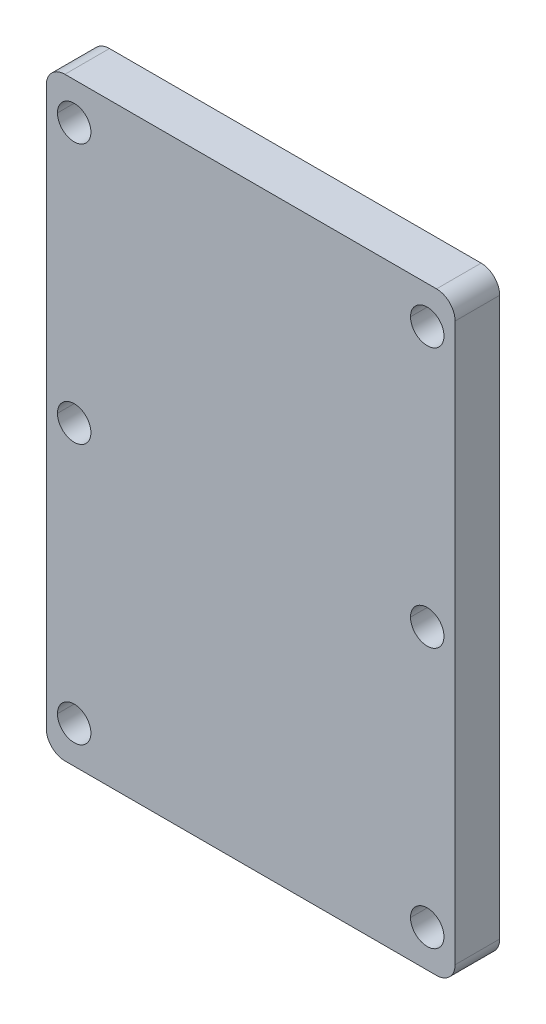
ISO-10303-21;
HEADER;
FILE_DESCRIPTION(('STEP AP214'),'2;1');
FILE_NAME('part.step','',(''),(''),'','','');
FILE_SCHEMA(('AUTOMOTIVE_DESIGN { 1 0 10303 214 1 1 1 1 }'));
ENDSEC;
DATA;
#1=APPLICATION_CONTEXT('core data for automotive mechanical design processes');
#2=APPLICATION_PROTOCOL_DEFINITION('international standard','automotive_design',2000,#1);
#3=PRODUCT_CONTEXT('',#1,'mechanical');
#4=PRODUCT('Part','Part','',(#3));
#5=PRODUCT_RELATED_PRODUCT_CATEGORY('part','',(#4));
#6=PRODUCT_DEFINITION_FORMATION('','',#4);
#7=PRODUCT_DEFINITION_CONTEXT('part definition',#1,'design');
#8=PRODUCT_DEFINITION('design','',#6,#7);
#9=PRODUCT_DEFINITION_SHAPE('','',#8);
#10=(LENGTH_UNIT() NAMED_UNIT(*) SI_UNIT(.MILLI.,.METRE.));
#11=(NAMED_UNIT(*) PLANE_ANGLE_UNIT() SI_UNIT($,.RADIAN.));
#12=(NAMED_UNIT(*) SI_UNIT($,.STERADIAN.) SOLID_ANGLE_UNIT());
#13=UNCERTAINTY_MEASURE_WITH_UNIT(LENGTH_MEASURE(1.E-05),#10,'distance_accuracy_value','');
#14=(GEOMETRIC_REPRESENTATION_CONTEXT(3) GLOBAL_UNCERTAINTY_ASSIGNED_CONTEXT((#13)) GLOBAL_UNIT_ASSIGNED_CONTEXT((#10,
#11,#12)) REPRESENTATION_CONTEXT('',''));
#15=CARTESIAN_POINT('',(0.,0.,0.));
#16=DIRECTION('',(0.,0.,1.));
#17=DIRECTION('',(1.,0.,0.));
#18=AXIS2_PLACEMENT_3D('',#15,#16,#17);
#19=CARTESIAN_POINT('',(-47.5,70.,55.));
#20=DIRECTION('',(0.,0.,-1.));
#21=DIRECTION('',(-1.,0.,0.));
#22=AXIS2_PLACEMENT_3D('',#19,#20,#21);
#23=CYLINDRICAL_SURFACE('',#22,4.5);
#24=DIRECTION('',(0.,0.,-1.));
#25=VECTOR('',#24,1.);
#26=CARTESIAN_POINT('',(-43.,70.,55.));
#27=LINE('',#26,#25);
#28=CARTESIAN_POINT('',(-43.,70.,12.));
#29=VERTEX_POINT('',#28);
#30=CARTESIAN_POINT('',(-43.,70.,0.));
#31=VERTEX_POINT('',#30);
#32=EDGE_CURVE('E385',#29,#31,#27,.T.);
#33=ORIENTED_EDGE('',*,*,#32,.F.);
#34=CARTESIAN_POINT('',(-47.5,70.,12.));
#35=DIRECTION('',(0.,0.,-1.));
#36=DIRECTION('',(1.,0.,0.));
#37=AXIS2_PLACEMENT_3D('',#34,#35,#36);
#38=CIRCLE('',#37,4.5);
#39=CARTESIAN_POINT('',(-52.,70.,12.));
#40=VERTEX_POINT('',#39);
#41=EDGE_CURVE('E204',#40,#29,#38,.T.);
#42=ORIENTED_EDGE('',*,*,#41,.F.);
#43=DIRECTION('',(0.,0.,-1.));
#44=VECTOR('',#43,1.);
#45=CARTESIAN_POINT('',(-52.,70.,55.));
#46=LINE('',#45,#44);
#47=CARTESIAN_POINT('',(-52.,70.,0.));
#48=VERTEX_POINT('',#47);
#49=EDGE_CURVE('E384',#40,#48,#46,.T.);
#50=ORIENTED_EDGE('',*,*,#49,.T.);
#51=CARTESIAN_POINT('',(-47.5,70.,0.));
#52=DIRECTION('',(0.,0.,1.));
#53=DIRECTION('',(1.,0.,0.));
#54=AXIS2_PLACEMENT_3D('',#51,#52,#53);
#55=CIRCLE('',#54,4.5);
#56=EDGE_CURVE('E310',#31,#48,#55,.T.);
#57=ORIENTED_EDGE('',*,*,#56,.F.);
#58=EDGE_LOOP('',(#33,#42,#50,#57));
#59=FACE_BOUND('',#58,.T.);
#60=ADVANCED_FACE('F17',(#59),#23,.F.);
#61=CARTESIAN_POINT('',(-47.5,0.,55.));
#62=DIRECTION('',(0.,0.,-1.));
#63=DIRECTION('',(-1.,0.,0.));
#64=AXIS2_PLACEMENT_3D('',#61,#62,#63);
#65=CYLINDRICAL_SURFACE('',#64,4.5);
#66=DIRECTION('',(0.,0.,-1.));
#67=VECTOR('',#66,1.);
#68=CARTESIAN_POINT('',(-43.,0.,55.));
#69=LINE('',#68,#67);
#70=CARTESIAN_POINT('',(-43.,0.,12.));
#71=VERTEX_POINT('',#70);
#72=CARTESIAN_POINT('',(-43.,0.,0.));
#73=VERTEX_POINT('',#72);
#74=EDGE_CURVE('E337',#71,#73,#69,.T.);
#75=ORIENTED_EDGE('',*,*,#74,.F.);
#76=CARTESIAN_POINT('',(-47.5,0.,12.));
#77=DIRECTION('',(0.,0.,-1.));
#78=DIRECTION('',(1.,0.,0.));
#79=AXIS2_PLACEMENT_3D('',#76,#77,#78);
#80=CIRCLE('',#79,4.5);
#81=CARTESIAN_POINT('',(-52.,0.,12.));
#82=VERTEX_POINT('',#81);
#83=EDGE_CURVE('E277',#82,#71,#80,.T.);
#84=ORIENTED_EDGE('',*,*,#83,.F.);
#85=DIRECTION('',(0.,0.,-1.));
#86=VECTOR('',#85,1.);
#87=CARTESIAN_POINT('',(-52.,0.,55.));
#88=LINE('',#87,#86);
#89=CARTESIAN_POINT('',(-52.,0.,0.));
#90=VERTEX_POINT('',#89);
#91=EDGE_CURVE('E336',#82,#90,#88,.T.);
#92=ORIENTED_EDGE('',*,*,#91,.T.);
#93=CARTESIAN_POINT('',(-47.5,0.,0.));
#94=DIRECTION('',(0.,0.,1.));
#95=DIRECTION('',(1.,0.,0.));
#96=AXIS2_PLACEMENT_3D('',#93,#94,#95);
#97=CIRCLE('',#96,4.5);
#98=EDGE_CURVE('E229',#73,#90,#97,.T.);
#99=ORIENTED_EDGE('',*,*,#98,.F.);
#100=EDGE_LOOP('',(#75,#84,#92,#99));
#101=FACE_BOUND('',#100,.T.);
#102=ADVANCED_FACE('F422',(#101),#65,.F.);
#103=CARTESIAN_POINT('',(-47.5,-70.,55.));
#104=DIRECTION('',(0.,0.,-1.));
#105=DIRECTION('',(-1.,0.,0.));
#106=AXIS2_PLACEMENT_3D('',#103,#104,#105);
#107=CYLINDRICAL_SURFACE('',#106,4.5);
#108=DIRECTION('',(0.,0.,-1.));
#109=VECTOR('',#108,1.);
#110=CARTESIAN_POINT('',(-43.,-70.,55.));
#111=LINE('',#110,#109);
#112=CARTESIAN_POINT('',(-43.,-70.,12.));
#113=VERTEX_POINT('',#112);
#114=CARTESIAN_POINT('',(-43.,-70.,0.));
#115=VERTEX_POINT('',#114);
#116=EDGE_CURVE('E327',#113,#115,#111,.T.);
#117=ORIENTED_EDGE('',*,*,#116,.F.);
#118=CARTESIAN_POINT('',(-47.5,-70.,12.));
#119=DIRECTION('',(0.,0.,-1.));
#120=DIRECTION('',(1.,0.,0.));
#121=AXIS2_PLACEMENT_3D('',#118,#119,#120);
#122=CIRCLE('',#121,4.5);
#123=CARTESIAN_POINT('',(-52.,-70.,12.));
#124=VERTEX_POINT('',#123);
#125=EDGE_CURVE('E274',#124,#113,#122,.T.);
#126=ORIENTED_EDGE('',*,*,#125,.F.);
#127=DIRECTION('',(0.,0.,-1.));
#128=VECTOR('',#127,1.);
#129=CARTESIAN_POINT('',(-52.,-70.,55.));
#130=LINE('',#129,#128);
#131=CARTESIAN_POINT('',(-52.,-70.,0.));
#132=VERTEX_POINT('',#131);
#133=EDGE_CURVE('E374',#124,#132,#130,.T.);
#134=ORIENTED_EDGE('',*,*,#133,.T.);
#135=CARTESIAN_POINT('',(-47.5,-70.,0.));
#136=DIRECTION('',(0.,0.,1.));
#137=DIRECTION('',(1.,0.,0.));
#138=AXIS2_PLACEMENT_3D('',#135,#136,#137);
#139=CIRCLE('',#138,4.5);
#140=EDGE_CURVE('E364',#115,#132,#139,.T.);
#141=ORIENTED_EDGE('',*,*,#140,.F.);
#142=EDGE_LOOP('',(#117,#126,#134,#141));
#143=FACE_BOUND('',#142,.T.);
#144=ADVANCED_FACE('F620',(#143),#107,.F.);
#145=CARTESIAN_POINT('',(47.5,70.,55.));
#146=DIRECTION('',(0.,0.,-1.));
#147=DIRECTION('',(-1.,0.,0.));
#148=AXIS2_PLACEMENT_3D('',#145,#146,#147);
#149=CYLINDRICAL_SURFACE('',#148,4.5);
#150=DIRECTION('',(0.,0.,-1.));
#151=VECTOR('',#150,1.);
#152=CARTESIAN_POINT('',(52.,70.,55.));
#153=LINE('',#152,#151);
#154=CARTESIAN_POINT('',(52.,70.,12.));
#155=VERTEX_POINT('',#154);
#156=CARTESIAN_POINT('',(52.,70.,0.));
#157=VERTEX_POINT('',#156);
#158=EDGE_CURVE('E242',#155,#157,#153,.T.);
#159=ORIENTED_EDGE('',*,*,#158,.F.);
#160=CARTESIAN_POINT('',(47.5,70.,12.));
#161=DIRECTION('',(0.,0.,1.));
#162=DIRECTION('',(1.,0.,0.));
#163=AXIS2_PLACEMENT_3D('',#160,#161,#162);
#164=CIRCLE('',#163,4.5);
#165=CARTESIAN_POINT('',(43.,70.,12.));
#166=VERTEX_POINT('',#165);
#167=EDGE_CURVE('E276',#155,#166,#164,.T.);
#168=ORIENTED_EDGE('',*,*,#167,.T.);
#169=DIRECTION('',(0.,0.,-1.));
#170=VECTOR('',#169,1.);
#171=CARTESIAN_POINT('',(43.,70.,55.));
#172=LINE('',#171,#170);
#173=CARTESIAN_POINT('',(43.,70.,0.));
#174=VERTEX_POINT('',#173);
#175=EDGE_CURVE('E273',#166,#174,#172,.T.);
#176=ORIENTED_EDGE('',*,*,#175,.T.);
#177=CARTESIAN_POINT('',(47.5,70.,0.));
#178=DIRECTION('',(0.,0.,-1.));
#179=DIRECTION('',(-1.,0.,0.));
#180=AXIS2_PLACEMENT_3D('',#177,#178,#179);
#181=CIRCLE('',#180,4.5);
#182=EDGE_CURVE('E322',#174,#157,#181,.T.);
#183=ORIENTED_EDGE('',*,*,#182,.T.);
#184=EDGE_LOOP('',(#159,#168,#176,#183));
#185=FACE_BOUND('',#184,.T.);
#186=ADVANCED_FACE('F624',(#185),#149,.F.);
#187=CARTESIAN_POINT('',(47.5,0.,55.));
#188=DIRECTION('',(0.,0.,-1.));
#189=DIRECTION('',(-1.,0.,0.));
#190=AXIS2_PLACEMENT_3D('',#187,#188,#189);
#191=CYLINDRICAL_SURFACE('',#190,4.5);
#192=DIRECTION('',(0.,0.,-1.));
#193=VECTOR('',#192,1.);
#194=CARTESIAN_POINT('',(52.,0.,55.));
#195=LINE('',#194,#193);
#196=CARTESIAN_POINT('',(52.,0.,12.));
#197=VERTEX_POINT('',#196);
#198=CARTESIAN_POINT('',(52.,0.,0.));
#199=VERTEX_POINT('',#198);
#200=EDGE_CURVE('E241',#197,#199,#195,.T.);
#201=ORIENTED_EDGE('',*,*,#200,.F.);
#202=CARTESIAN_POINT('',(47.5,0.,12.));
#203=DIRECTION('',(0.,0.,1.));
#204=DIRECTION('',(1.,0.,0.));
#205=AXIS2_PLACEMENT_3D('',#202,#203,#204);
#206=CIRCLE('',#205,4.5);
#207=CARTESIAN_POINT('',(43.,0.,12.));
#208=VERTEX_POINT('',#207);
#209=EDGE_CURVE('E285',#197,#208,#206,.T.);
#210=ORIENTED_EDGE('',*,*,#209,.T.);
#211=DIRECTION('',(0.,0.,-1.));
#212=VECTOR('',#211,1.);
#213=CARTESIAN_POINT('',(43.,0.,55.));
#214=LINE('',#213,#212);
#215=CARTESIAN_POINT('',(43.,0.,0.));
#216=VERTEX_POINT('',#215);
#217=EDGE_CURVE('E240',#208,#216,#214,.T.);
#218=ORIENTED_EDGE('',*,*,#217,.T.);
#219=CARTESIAN_POINT('',(47.5,0.,0.));
#220=DIRECTION('',(0.,0.,-1.));
#221=DIRECTION('',(-1.,0.,0.));
#222=AXIS2_PLACEMENT_3D('',#219,#220,#221);
#223=CIRCLE('',#222,4.5);
#224=EDGE_CURVE('E28',#216,#199,#223,.T.);
#225=ORIENTED_EDGE('',*,*,#224,.T.);
#226=EDGE_LOOP('',(#201,#210,#218,#225));
#227=FACE_BOUND('',#226,.T.);
#228=ADVANCED_FACE('F645',(#227),#191,.F.);
#229=CARTESIAN_POINT('',(47.5,-70.,55.));
#230=DIRECTION('',(0.,0.,-1.));
#231=DIRECTION('',(-1.,0.,0.));
#232=AXIS2_PLACEMENT_3D('',#229,#230,#231);
#233=CYLINDRICAL_SURFACE('',#232,4.5);
#234=DIRECTION('',(0.,0.,-1.));
#235=VECTOR('',#234,1.);
#236=CARTESIAN_POINT('',(52.,-70.,55.));
#237=LINE('',#236,#235);
#238=CARTESIAN_POINT('',(52.,-70.,12.));
#239=VERTEX_POINT('',#238);
#240=CARTESIAN_POINT('',(52.,-70.,0.));
#241=VERTEX_POINT('',#240);
#242=EDGE_CURVE('E256',#239,#241,#237,.T.);
#243=ORIENTED_EDGE('',*,*,#242,.F.);
#244=CARTESIAN_POINT('',(47.5,-70.,12.));
#245=DIRECTION('',(0.,0.,1.));
#246=DIRECTION('',(1.,0.,0.));
#247=AXIS2_PLACEMENT_3D('',#244,#245,#246);
#248=CIRCLE('',#247,4.5);
#249=CARTESIAN_POINT('',(43.,-70.,12.));
#250=VERTEX_POINT('',#249);
#251=EDGE_CURVE('E306',#239,#250,#248,.T.);
#252=ORIENTED_EDGE('',*,*,#251,.T.);
#253=DIRECTION('',(0.,0.,-1.));
#254=VECTOR('',#253,1.);
#255=CARTESIAN_POINT('',(43.,-70.,55.));
#256=LINE('',#255,#254);
#257=CARTESIAN_POINT('',(43.,-70.,0.));
#258=VERTEX_POINT('',#257);
#259=EDGE_CURVE('E326',#250,#258,#256,.T.);
#260=ORIENTED_EDGE('',*,*,#259,.T.);
#261=CARTESIAN_POINT('',(47.5,-70.,0.));
#262=DIRECTION('',(0.,0.,-1.));
#263=DIRECTION('',(-1.,0.,0.));
#264=AXIS2_PLACEMENT_3D('',#261,#262,#263);
#265=CIRCLE('',#264,4.5);
#266=EDGE_CURVE('E11',#258,#241,#265,.T.);
#267=ORIENTED_EDGE('',*,*,#266,.T.);
#268=EDGE_LOOP('',(#243,#252,#260,#267));
#269=FACE_BOUND('',#268,.T.);
#270=ADVANCED_FACE('F649',(#269),#233,.F.);
#271=CARTESIAN_POINT('',(50.,75.,12.));
#272=DIRECTION('',(0.,0.,-1.));
#273=DIRECTION('',(-1.,0.,0.));
#274=AXIS2_PLACEMENT_3D('',#271,#272,#273);
#275=CYLINDRICAL_SURFACE('',#274,5.);
#276=CARTESIAN_POINT('',(50.,75.,12.));
#277=DIRECTION('',(0.,0.,1.));
#278=DIRECTION('',(1.,0.,0.));
#279=AXIS2_PLACEMENT_3D('',#276,#277,#278);
#280=CIRCLE('',#279,5.);
#281=CARTESIAN_POINT('',(55.,75.,12.));
#282=VERTEX_POINT('',#281);
#283=CARTESIAN_POINT('',(50.,80.,12.));
#284=VERTEX_POINT('',#283);
#285=EDGE_CURVE('E359',#282,#284,#280,.T.);
#286=ORIENTED_EDGE('',*,*,#285,.F.);
#287=DIRECTION('',(0.,0.,1.));
#288=VECTOR('',#287,1.);
#289=CARTESIAN_POINT('',(55.,75.,12.));
#290=LINE('',#289,#288);
#291=CARTESIAN_POINT('',(55.,75.,0.));
#292=VERTEX_POINT('',#291);
#293=EDGE_CURVE('E356',#292,#282,#290,.T.);
#294=ORIENTED_EDGE('',*,*,#293,.F.);
#295=CARTESIAN_POINT('',(50.,75.,0.));
#296=DIRECTION('',(0.,0.,-1.));
#297=DIRECTION('',(1.,0.,0.));
#298=AXIS2_PLACEMENT_3D('',#295,#296,#297);
#299=CIRCLE('',#298,5.);
#300=CARTESIAN_POINT('',(50.,80.,0.));
#301=VERTEX_POINT('',#300);
#302=EDGE_CURVE('E313',#301,#292,#299,.T.);
#303=ORIENTED_EDGE('',*,*,#302,.F.);
#304=DIRECTION('',(0.,0.,-1.));
#305=VECTOR('',#304,1.);
#306=CARTESIAN_POINT('',(50.,80.,12.));
#307=LINE('',#306,#305);
#308=EDGE_CURVE('E225',#284,#301,#307,.T.);
#309=ORIENTED_EDGE('',*,*,#308,.F.);
#310=EDGE_LOOP('',(#286,#294,#303,#309));
#311=FACE_BOUND('',#310,.T.);
#312=ADVANCED_FACE('F671',(#311),#275,.T.);
#313=CARTESIAN_POINT('',(-50.,75.,12.));
#314=DIRECTION('',(0.,0.,-1.));
#315=DIRECTION('',(-1.,0.,0.));
#316=AXIS2_PLACEMENT_3D('',#313,#314,#315);
#317=CYLINDRICAL_SURFACE('',#316,5.);
#318=CARTESIAN_POINT('',(-50.,75.,12.));
#319=DIRECTION('',(0.,0.,1.));
#320=DIRECTION('',(1.,0.,0.));
#321=AXIS2_PLACEMENT_3D('',#318,#319,#320);
#322=CIRCLE('',#321,5.);
#323=CARTESIAN_POINT('',(-50.,80.,12.));
#324=VERTEX_POINT('',#323);
#325=CARTESIAN_POINT('',(-55.,75.,12.));
#326=VERTEX_POINT('',#325);
#327=EDGE_CURVE('E205',#324,#326,#322,.T.);
#328=ORIENTED_EDGE('',*,*,#327,.F.);
#329=DIRECTION('',(0.,0.,1.));
#330=VECTOR('',#329,1.);
#331=CARTESIAN_POINT('',(-50.,80.,12.));
#332=LINE('',#331,#330);
#333=CARTESIAN_POINT('',(-50.,80.,0.));
#334=VERTEX_POINT('',#333);
#335=EDGE_CURVE('E355',#334,#324,#332,.T.);
#336=ORIENTED_EDGE('',*,*,#335,.F.);
#337=CARTESIAN_POINT('',(-50.,75.,0.));
#338=DIRECTION('',(0.,0.,-1.));
#339=DIRECTION('',(1.,0.,0.));
#340=AXIS2_PLACEMENT_3D('',#337,#338,#339);
#341=CIRCLE('',#340,5.);
#342=CARTESIAN_POINT('',(-55.,75.,0.));
#343=VERTEX_POINT('',#342);
#344=EDGE_CURVE('E309',#343,#334,#341,.T.);
#345=ORIENTED_EDGE('',*,*,#344,.F.);
#346=DIRECTION('',(0.,0.,-1.));
#347=VECTOR('',#346,1.);
#348=CARTESIAN_POINT('',(-55.,75.,12.));
#349=LINE('',#348,#347);
#350=EDGE_CURVE('E214',#326,#343,#349,.T.);
#351=ORIENTED_EDGE('',*,*,#350,.F.);
#352=EDGE_LOOP('',(#328,#336,#345,#351));
#353=FACE_BOUND('',#352,.T.);
#354=ADVANCED_FACE('F450',(#353),#317,.T.);
#355=CARTESIAN_POINT('',(-50.,-75.,12.));
#356=DIRECTION('',(0.,0.,-1.));
#357=DIRECTION('',(-1.,0.,0.));
#358=AXIS2_PLACEMENT_3D('',#355,#356,#357);
#359=CYLINDRICAL_SURFACE('',#358,5.);
#360=CARTESIAN_POINT('',(-50.,-75.,12.));
#361=DIRECTION('',(0.,0.,1.));
#362=DIRECTION('',(1.,0.,0.));
#363=AXIS2_PLACEMENT_3D('',#360,#361,#362);
#364=CIRCLE('',#363,5.);
#365=CARTESIAN_POINT('',(-55.,-75.,12.));
#366=VERTEX_POINT('',#365);
#367=CARTESIAN_POINT('',(-50.,-80.,12.));
#368=VERTEX_POINT('',#367);
#369=EDGE_CURVE('E21',#366,#368,#364,.T.);
#370=ORIENTED_EDGE('',*,*,#369,.F.);
#371=DIRECTION('',(0.,0.,1.));
#372=VECTOR('',#371,1.);
#373=CARTESIAN_POINT('',(-55.,-75.,12.));
#374=LINE('',#373,#372);
#375=CARTESIAN_POINT('',(-55.,-75.,0.));
#376=VERTEX_POINT('',#375);
#377=EDGE_CURVE('E198',#376,#366,#374,.T.);
#378=ORIENTED_EDGE('',*,*,#377,.F.);
#379=CARTESIAN_POINT('',(-50.,-75.,0.));
#380=DIRECTION('',(0.,0.,-1.));
#381=DIRECTION('',(1.,0.,0.));
#382=AXIS2_PLACEMENT_3D('',#379,#380,#381);
#383=CIRCLE('',#382,5.);
#384=CARTESIAN_POINT('',(-50.,-80.,0.));
#385=VERTEX_POINT('',#384);
#386=EDGE_CURVE('E305',#385,#376,#383,.T.);
#387=ORIENTED_EDGE('',*,*,#386,.F.);
#388=DIRECTION('',(0.,0.,-1.));
#389=VECTOR('',#388,1.);
#390=CARTESIAN_POINT('',(-50.,-80.,12.));
#391=LINE('',#390,#389);
#392=EDGE_CURVE('E201',#368,#385,#391,.T.);
#393=ORIENTED_EDGE('',*,*,#392,.F.);
#394=EDGE_LOOP('',(#370,#378,#387,#393));
#395=FACE_BOUND('',#394,.T.);
#396=ADVANCED_FACE('F196',(#395),#359,.T.);
#397=CARTESIAN_POINT('',(50.,-75.,12.));
#398=DIRECTION('',(0.,0.,-1.));
#399=DIRECTION('',(-1.,0.,0.));
#400=AXIS2_PLACEMENT_3D('',#397,#398,#399);
#401=CYLINDRICAL_SURFACE('',#400,5.);
#402=CARTESIAN_POINT('',(50.,-75.,12.));
#403=DIRECTION('',(0.,0.,1.));
#404=DIRECTION('',(1.,0.,0.));
#405=AXIS2_PLACEMENT_3D('',#402,#403,#404);
#406=CIRCLE('',#405,5.);
#407=CARTESIAN_POINT('',(50.,-80.,12.));
#408=VERTEX_POINT('',#407);
#409=CARTESIAN_POINT('',(55.,-75.,12.));
#410=VERTEX_POINT('',#409);
#411=EDGE_CURVE('E341',#408,#410,#406,.T.);
#412=ORIENTED_EDGE('',*,*,#411,.F.);
#413=DIRECTION('',(0.,0.,1.));
#414=VECTOR('',#413,1.);
#415=CARTESIAN_POINT('',(50.,-80.,12.));
#416=LINE('',#415,#414);
#417=CARTESIAN_POINT('',(50.,-80.,0.));
#418=VERTEX_POINT('',#417);
#419=EDGE_CURVE('E235',#418,#408,#416,.T.);
#420=ORIENTED_EDGE('',*,*,#419,.F.);
#421=CARTESIAN_POINT('',(50.,-75.,0.));
#422=DIRECTION('',(0.,0.,-1.));
#423=DIRECTION('',(1.,0.,0.));
#424=AXIS2_PLACEMENT_3D('',#421,#422,#423);
#425=CIRCLE('',#424,5.);
#426=CARTESIAN_POINT('',(55.,-75.,0.));
#427=VERTEX_POINT('',#426);
#428=EDGE_CURVE('E302',#427,#418,#425,.T.);
#429=ORIENTED_EDGE('',*,*,#428,.F.);
#430=DIRECTION('',(0.,0.,-1.));
#431=VECTOR('',#430,1.);
#432=CARTESIAN_POINT('',(55.,-75.,12.));
#433=LINE('',#432,#431);
#434=EDGE_CURVE('E314',#410,#427,#433,.T.);
#435=ORIENTED_EDGE('',*,*,#434,.F.);
#436=EDGE_LOOP('',(#412,#420,#429,#435));
#437=FACE_BOUND('',#436,.T.);
#438=ADVANCED_FACE('F428',(#437),#401,.T.);
#439=CARTESIAN_POINT('',(0.,0.,0.));
#440=DIRECTION('',(0.,0.,1.));
#441=DIRECTION('',(1.,0.,0.));
#442=AXIS2_PLACEMENT_3D('',#439,#440,#441);
#443=PLANE('',#442);
#444=ORIENTED_EDGE('',*,*,#266,.F.);
#445=CARTESIAN_POINT('',(47.5,-70.,0.));
#446=DIRECTION('',(0.,0.,-1.));
#447=DIRECTION('',(-1.,0.,0.));
#448=AXIS2_PLACEMENT_3D('',#445,#446,#447);
#449=CIRCLE('',#448,4.5);
#450=EDGE_CURVE('E265',#241,#258,#449,.T.);
#451=ORIENTED_EDGE('',*,*,#450,.F.);
#452=EDGE_LOOP('',(#444,#451));
#453=FACE_BOUND('',#452,.T.);
#454=ORIENTED_EDGE('',*,*,#224,.F.);
#455=CARTESIAN_POINT('',(47.5,0.,0.));
#456=DIRECTION('',(0.,0.,-1.));
#457=DIRECTION('',(-1.,0.,0.));
#458=AXIS2_PLACEMENT_3D('',#455,#456,#457);
#459=CIRCLE('',#458,4.5);
#460=EDGE_CURVE('E236',#199,#216,#459,.T.);
#461=ORIENTED_EDGE('',*,*,#460,.F.);
#462=EDGE_LOOP('',(#454,#461));
#463=FACE_BOUND('',#462,.T.);
#464=ORIENTED_EDGE('',*,*,#182,.F.);
#465=CARTESIAN_POINT('',(47.5,70.,0.));
#466=DIRECTION('',(0.,0.,-1.));
#467=DIRECTION('',(-1.,0.,0.));
#468=AXIS2_PLACEMENT_3D('',#465,#466,#467);
#469=CIRCLE('',#468,4.5);
#470=EDGE_CURVE('E245',#157,#174,#469,.T.);
#471=ORIENTED_EDGE('',*,*,#470,.F.);
#472=EDGE_LOOP('',(#464,#471));
#473=FACE_BOUND('',#472,.T.);
#474=CARTESIAN_POINT('',(-47.5,-70.,0.));
#475=DIRECTION('',(0.,0.,1.));
#476=DIRECTION('',(1.,0.,0.));
#477=AXIS2_PLACEMENT_3D('',#474,#475,#476);
#478=CIRCLE('',#477,4.5);
#479=EDGE_CURVE('E331',#132,#115,#478,.T.);
#480=ORIENTED_EDGE('',*,*,#479,.T.);
#481=ORIENTED_EDGE('',*,*,#140,.T.);
#482=EDGE_LOOP('',(#480,#481));
#483=FACE_BOUND('',#482,.T.);
#484=CARTESIAN_POINT('',(-47.5,0.,0.));
#485=DIRECTION('',(0.,0.,1.));
#486=DIRECTION('',(1.,0.,0.));
#487=AXIS2_PLACEMENT_3D('',#484,#485,#486);
#488=CIRCLE('',#487,4.5);
#489=EDGE_CURVE('E333',#90,#73,#488,.T.);
#490=ORIENTED_EDGE('',*,*,#489,.T.);
#491=ORIENTED_EDGE('',*,*,#98,.T.);
#492=EDGE_LOOP('',(#490,#491));
#493=FACE_BOUND('',#492,.T.);
#494=CARTESIAN_POINT('',(-47.5,70.,0.));
#495=DIRECTION('',(0.,0.,1.));
#496=DIRECTION('',(1.,0.,0.));
#497=AXIS2_PLACEMENT_3D('',#494,#495,#496);
#498=CIRCLE('',#497,4.5);
#499=EDGE_CURVE('E380',#48,#31,#498,.T.);
#500=ORIENTED_EDGE('',*,*,#499,.T.);
#501=ORIENTED_EDGE('',*,*,#56,.T.);
#502=EDGE_LOOP('',(#500,#501));
#503=FACE_BOUND('',#502,.T.);
#504=DIRECTION('',(0.,1.,0.));
#505=VECTOR('',#504,1.);
#506=CARTESIAN_POINT('',(55.,80.,0.));
#507=LINE('',#506,#505);
#508=EDGE_CURVE('E318',#427,#292,#507,.T.);
#509=ORIENTED_EDGE('',*,*,#508,.F.);
#510=ORIENTED_EDGE('',*,*,#428,.T.);
#511=DIRECTION('',(1.,0.,0.));
#512=VECTOR('',#511,1.);
#513=CARTESIAN_POINT('',(-55.,-80.,0.));
#514=LINE('',#513,#512);
#515=EDGE_CURVE('E231',#385,#418,#514,.T.);
#516=ORIENTED_EDGE('',*,*,#515,.F.);
#517=ORIENTED_EDGE('',*,*,#386,.T.);
#518=DIRECTION('',(0.,-1.,0.));
#519=VECTOR('',#518,1.);
#520=CARTESIAN_POINT('',(-55.,80.,0.));
#521=LINE('',#520,#519);
#522=EDGE_CURVE('E218',#343,#376,#521,.T.);
#523=ORIENTED_EDGE('',*,*,#522,.F.);
#524=ORIENTED_EDGE('',*,*,#344,.T.);
#525=DIRECTION('',(-1.,0.,0.));
#526=VECTOR('',#525,1.);
#527=CARTESIAN_POINT('',(-55.,80.,0.));
#528=LINE('',#527,#526);
#529=EDGE_CURVE('E351',#301,#334,#528,.T.);
#530=ORIENTED_EDGE('',*,*,#529,.F.);
#531=ORIENTED_EDGE('',*,*,#302,.T.);
#532=EDGE_LOOP('',(#509,#510,#516,#517,#523,#524,#530,#531));
#533=FACE_BOUND('',#532,.T.);
#534=ADVANCED_FACE('F425',(#453,#463,#473,#483,#493,#503,#533),#443,.F.);
#535=CARTESIAN_POINT('',(0.,0.,12.));
#536=DIRECTION('',(0.,0.,1.));
#537=DIRECTION('',(1.,0.,0.));
#538=AXIS2_PLACEMENT_3D('',#535,#536,#537);
#539=PLANE('',#538);
#540=CARTESIAN_POINT('',(47.5,-70.,12.));
#541=DIRECTION('',(0.,0.,1.));
#542=DIRECTION('',(1.,0.,0.));
#543=AXIS2_PLACEMENT_3D('',#540,#541,#542);
#544=CIRCLE('',#543,4.5);
#545=EDGE_CURVE('E249',#250,#239,#544,.T.);
#546=ORIENTED_EDGE('',*,*,#545,.F.);
#547=ORIENTED_EDGE('',*,*,#251,.F.);
#548=EDGE_LOOP('',(#546,#547));
#549=FACE_BOUND('',#548,.T.);
#550=CARTESIAN_POINT('',(47.5,0.,12.));
#551=DIRECTION('',(0.,0.,1.));
#552=DIRECTION('',(1.,0.,0.));
#553=AXIS2_PLACEMENT_3D('',#550,#551,#552);
#554=CIRCLE('',#553,4.5);
#555=EDGE_CURVE('E270',#208,#197,#554,.T.);
#556=ORIENTED_EDGE('',*,*,#555,.F.);
#557=ORIENTED_EDGE('',*,*,#209,.F.);
#558=EDGE_LOOP('',(#556,#557));
#559=FACE_BOUND('',#558,.T.);
#560=CARTESIAN_POINT('',(47.5,70.,12.));
#561=DIRECTION('',(0.,0.,1.));
#562=DIRECTION('',(1.,0.,0.));
#563=AXIS2_PLACEMENT_3D('',#560,#561,#562);
#564=CIRCLE('',#563,4.5);
#565=EDGE_CURVE('E246',#166,#155,#564,.T.);
#566=ORIENTED_EDGE('',*,*,#565,.F.);
#567=ORIENTED_EDGE('',*,*,#167,.F.);
#568=EDGE_LOOP('',(#566,#567));
#569=FACE_BOUND('',#568,.T.);
#570=ORIENTED_EDGE('',*,*,#125,.T.);
#571=CARTESIAN_POINT('',(-47.5,-70.,12.));
#572=DIRECTION('',(0.,0.,-1.));
#573=DIRECTION('',(1.,0.,0.));
#574=AXIS2_PLACEMENT_3D('',#571,#572,#573);
#575=CIRCLE('',#574,4.5);
#576=EDGE_CURVE('E332',#113,#124,#575,.T.);
#577=ORIENTED_EDGE('',*,*,#576,.T.);
#578=EDGE_LOOP('',(#570,#577));
#579=FACE_BOUND('',#578,.T.);
#580=ORIENTED_EDGE('',*,*,#83,.T.);
#581=CARTESIAN_POINT('',(-47.5,0.,12.));
#582=DIRECTION('',(0.,0.,-1.));
#583=DIRECTION('',(1.,0.,0.));
#584=AXIS2_PLACEMENT_3D('',#581,#582,#583);
#585=CIRCLE('',#584,4.5);
#586=EDGE_CURVE('E402',#71,#82,#585,.T.);
#587=ORIENTED_EDGE('',*,*,#586,.T.);
#588=EDGE_LOOP('',(#580,#587));
#589=FACE_BOUND('',#588,.T.);
#590=ORIENTED_EDGE('',*,*,#41,.T.);
#591=CARTESIAN_POINT('',(-47.5,70.,12.));
#592=DIRECTION('',(0.,0.,-1.));
#593=DIRECTION('',(1.,0.,0.));
#594=AXIS2_PLACEMENT_3D('',#591,#592,#593);
#595=CIRCLE('',#594,4.5);
#596=EDGE_CURVE('E297',#29,#40,#595,.T.);
#597=ORIENTED_EDGE('',*,*,#596,.T.);
#598=EDGE_LOOP('',(#590,#597));
#599=FACE_BOUND('',#598,.T.);
#600=DIRECTION('',(1.,0.,0.));
#601=VECTOR('',#600,1.);
#602=CARTESIAN_POINT('',(-55.,-80.,12.));
#603=LINE('',#602,#601);
#604=EDGE_CURVE('E342',#368,#408,#603,.T.);
#605=ORIENTED_EDGE('',*,*,#604,.T.);
#606=ORIENTED_EDGE('',*,*,#411,.T.);
#607=DIRECTION('',(0.,1.,0.));
#608=VECTOR('',#607,1.);
#609=CARTESIAN_POINT('',(55.,80.,12.));
#610=LINE('',#609,#608);
#611=EDGE_CURVE('E319',#410,#282,#610,.T.);
#612=ORIENTED_EDGE('',*,*,#611,.T.);
#613=ORIENTED_EDGE('',*,*,#285,.T.);
#614=DIRECTION('',(-1.,0.,0.));
#615=VECTOR('',#614,1.);
#616=CARTESIAN_POINT('',(-55.,80.,12.));
#617=LINE('',#616,#615);
#618=EDGE_CURVE('E393',#284,#324,#617,.T.);
#619=ORIENTED_EDGE('',*,*,#618,.T.);
#620=ORIENTED_EDGE('',*,*,#327,.T.);
#621=DIRECTION('',(0.,-1.,0.));
#622=VECTOR('',#621,1.);
#623=CARTESIAN_POINT('',(-55.,80.,12.));
#624=LINE('',#623,#622);
#625=EDGE_CURVE('E207',#326,#366,#624,.T.);
#626=ORIENTED_EDGE('',*,*,#625,.T.);
#627=ORIENTED_EDGE('',*,*,#369,.T.);
#628=EDGE_LOOP('',(#605,#606,#612,#613,#619,#620,#626,#627));
#629=FACE_BOUND('',#628,.T.);
#630=ADVANCED_FACE('F208',(#549,#559,#569,#579,#589,#599,#629),#539,.T.);
#631=CARTESIAN_POINT('',(-55.,-80.,12.));
#632=DIRECTION('',(0.,1.,0.));
#633=DIRECTION('',(1.,0.,0.));
#634=AXIS2_PLACEMENT_3D('',#631,#632,#633);
#635=PLANE('',#634);
#636=ORIENTED_EDGE('',*,*,#515,.T.);
#637=ORIENTED_EDGE('',*,*,#419,.T.);
#638=ORIENTED_EDGE('',*,*,#604,.F.);
#639=ORIENTED_EDGE('',*,*,#392,.T.);
#640=EDGE_LOOP('',(#636,#637,#638,#639));
#641=FACE_BOUND('',#640,.T.);
#642=ADVANCED_FACE('F447',(#641),#635,.F.);
#643=CARTESIAN_POINT('',(-55.,80.,12.));
#644=DIRECTION('',(1.,0.,0.));
#645=DIRECTION('',(0.,-1.,0.));
#646=AXIS2_PLACEMENT_3D('',#643,#644,#645);
#647=PLANE('',#646);
#648=ORIENTED_EDGE('',*,*,#522,.T.);
#649=ORIENTED_EDGE('',*,*,#377,.T.);
#650=ORIENTED_EDGE('',*,*,#625,.F.);
#651=ORIENTED_EDGE('',*,*,#350,.T.);
#652=EDGE_LOOP('',(#648,#649,#650,#651));
#653=FACE_BOUND('',#652,.T.);
#654=ADVANCED_FACE('F216',(#653),#647,.F.);
#655=CARTESIAN_POINT('',(-55.,80.,12.));
#656=DIRECTION('',(0.,-1.,0.));
#657=DIRECTION('',(0.,0.,-1.));
#658=AXIS2_PLACEMENT_3D('',#655,#656,#657);
#659=PLANE('',#658);
#660=ORIENTED_EDGE('',*,*,#529,.T.);
#661=ORIENTED_EDGE('',*,*,#335,.T.);
#662=ORIENTED_EDGE('',*,*,#618,.F.);
#663=ORIENTED_EDGE('',*,*,#308,.T.);
#664=EDGE_LOOP('',(#660,#661,#662,#663));
#665=FACE_BOUND('',#664,.T.);
#666=ADVANCED_FACE('F19',(#665),#659,.F.);
#667=CARTESIAN_POINT('',(55.,80.,12.));
#668=DIRECTION('',(-1.,0.,0.));
#669=DIRECTION('',(0.,0.,1.));
#670=AXIS2_PLACEMENT_3D('',#667,#668,#669);
#671=PLANE('',#670);
#672=ORIENTED_EDGE('',*,*,#611,.F.);
#673=ORIENTED_EDGE('',*,*,#434,.T.);
#674=ORIENTED_EDGE('',*,*,#508,.T.);
#675=ORIENTED_EDGE('',*,*,#293,.T.);
#676=EDGE_LOOP('',(#672,#673,#674,#675));
#677=FACE_BOUND('',#676,.T.);
#678=ADVANCED_FACE('F442',(#677),#671,.F.);
#679=CARTESIAN_POINT('',(47.5,-70.,55.));
#680=DIRECTION('',(0.,0.,-1.));
#681=DIRECTION('',(-1.,0.,0.));
#682=AXIS2_PLACEMENT_3D('',#679,#680,#681);
#683=CYLINDRICAL_SURFACE('',#682,4.5);
#684=ORIENTED_EDGE('',*,*,#545,.T.);
#685=ORIENTED_EDGE('',*,*,#242,.T.);
#686=ORIENTED_EDGE('',*,*,#450,.T.);
#687=ORIENTED_EDGE('',*,*,#259,.F.);
#688=EDGE_LOOP('',(#684,#685,#686,#687));
#689=FACE_BOUND('',#688,.T.);
#690=ADVANCED_FACE('F640',(#689),#683,.F.);
#691=CARTESIAN_POINT('',(47.5,0.,55.));
#692=DIRECTION('',(0.,0.,-1.));
#693=DIRECTION('',(-1.,0.,0.));
#694=AXIS2_PLACEMENT_3D('',#691,#692,#693);
#695=CYLINDRICAL_SURFACE('',#694,4.5);
#696=ORIENTED_EDGE('',*,*,#555,.T.);
#697=ORIENTED_EDGE('',*,*,#200,.T.);
#698=ORIENTED_EDGE('',*,*,#460,.T.);
#699=ORIENTED_EDGE('',*,*,#217,.F.);
#700=EDGE_LOOP('',(#696,#697,#698,#699));
#701=FACE_BOUND('',#700,.T.);
#702=ADVANCED_FACE('F687',(#701),#695,.F.);
#703=CARTESIAN_POINT('',(47.5,70.,55.));
#704=DIRECTION('',(0.,0.,-1.));
#705=DIRECTION('',(-1.,0.,0.));
#706=AXIS2_PLACEMENT_3D('',#703,#704,#705);
#707=CYLINDRICAL_SURFACE('',#706,4.5);
#708=ORIENTED_EDGE('',*,*,#565,.T.);
#709=ORIENTED_EDGE('',*,*,#158,.T.);
#710=ORIENTED_EDGE('',*,*,#470,.T.);
#711=ORIENTED_EDGE('',*,*,#175,.F.);
#712=EDGE_LOOP('',(#708,#709,#710,#711));
#713=FACE_BOUND('',#712,.T.);
#714=ADVANCED_FACE('F731',(#713),#707,.F.);
#715=CARTESIAN_POINT('',(-47.5,-70.,55.));
#716=DIRECTION('',(0.,0.,-1.));
#717=DIRECTION('',(-1.,0.,0.));
#718=AXIS2_PLACEMENT_3D('',#715,#716,#717);
#719=CYLINDRICAL_SURFACE('',#718,4.5);
#720=ORIENTED_EDGE('',*,*,#576,.F.);
#721=ORIENTED_EDGE('',*,*,#116,.T.);
#722=ORIENTED_EDGE('',*,*,#479,.F.);
#723=ORIENTED_EDGE('',*,*,#133,.F.);
#724=EDGE_LOOP('',(#720,#721,#722,#723));
#725=FACE_BOUND('',#724,.T.);
#726=ADVANCED_FACE('F704',(#725),#719,.F.);
#727=CARTESIAN_POINT('',(-47.5,0.,55.));
#728=DIRECTION('',(0.,0.,-1.));
#729=DIRECTION('',(-1.,0.,0.));
#730=AXIS2_PLACEMENT_3D('',#727,#728,#729);
#731=CYLINDRICAL_SURFACE('',#730,4.5);
#732=ORIENTED_EDGE('',*,*,#586,.F.);
#733=ORIENTED_EDGE('',*,*,#74,.T.);
#734=ORIENTED_EDGE('',*,*,#489,.F.);
#735=ORIENTED_EDGE('',*,*,#91,.F.);
#736=EDGE_LOOP('',(#732,#733,#734,#735));
#737=FACE_BOUND('',#736,.T.);
#738=ADVANCED_FACE('F419',(#737),#731,.F.);
#739=CARTESIAN_POINT('',(-47.5,70.,55.));
#740=DIRECTION('',(0.,0.,-1.));
#741=DIRECTION('',(-1.,0.,0.));
#742=AXIS2_PLACEMENT_3D('',#739,#740,#741);
#743=CYLINDRICAL_SURFACE('',#742,4.5);
#744=ORIENTED_EDGE('',*,*,#596,.F.);
#745=ORIENTED_EDGE('',*,*,#32,.T.);
#746=ORIENTED_EDGE('',*,*,#499,.F.);
#747=ORIENTED_EDGE('',*,*,#49,.F.);
#748=EDGE_LOOP('',(#744,#745,#746,#747));
#749=FACE_BOUND('',#748,.T.);
#750=ADVANCED_FACE('F703',(#749),#743,.F.);
#751=CLOSED_SHELL('',(#60,#102,#144,#186,#228,#270,#312,#354,#396,#438,#534,#630,#642,#654,#666,
#678,#690,#702,#714,#726,#738,#750));
#752=MANIFOLD_SOLID_BREP('B1',#751);
#753=ADVANCED_BREP_SHAPE_REPRESENTATION('',(#18,#752),#14);
#754=SHAPE_DEFINITION_REPRESENTATION(#9,#753);
ENDSEC;
END-ISO-10303-21;
